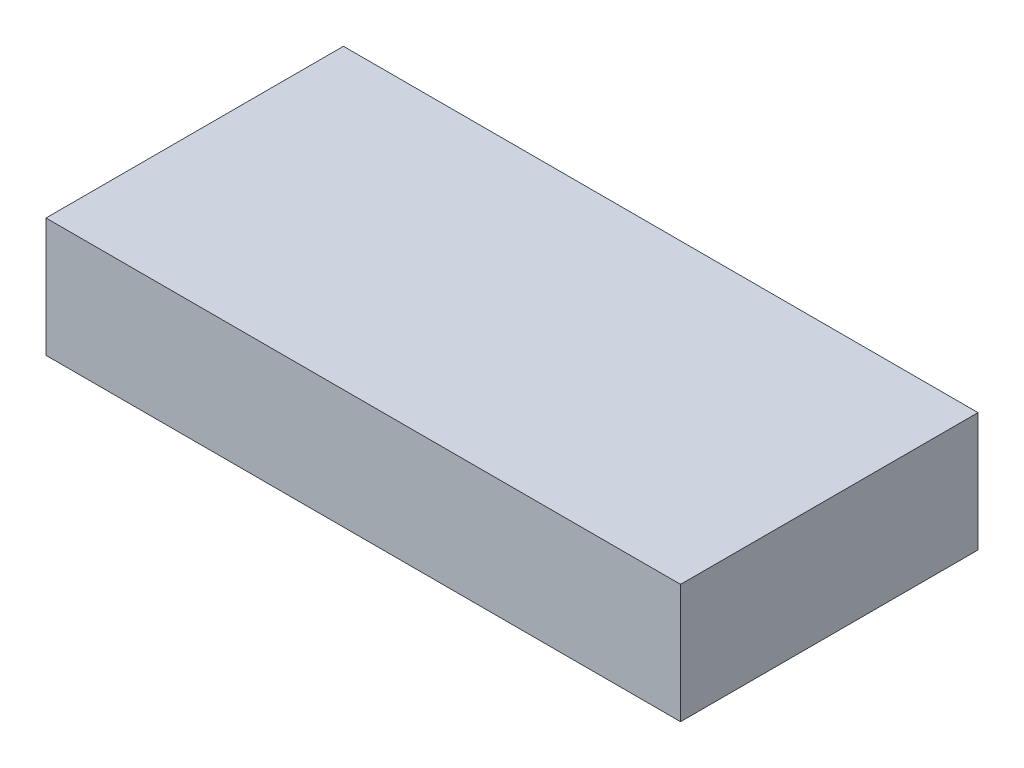
ISO-10303-21;
HEADER;
FILE_DESCRIPTION(('STEP AP214'),'2;1');
FILE_NAME('part.step','',(''),(''),'','','');
FILE_SCHEMA(('AUTOMOTIVE_DESIGN { 1 0 10303 214 1 1 1 1 }'));
ENDSEC;
DATA;
#1=APPLICATION_CONTEXT('core data for automotive mechanical design processes');
#2=APPLICATION_PROTOCOL_DEFINITION('international standard','automotive_design',2000,#1);
#3=PRODUCT_CONTEXT('',#1,'mechanical');
#4=PRODUCT('Part','Part','',(#3));
#5=PRODUCT_RELATED_PRODUCT_CATEGORY('part','',(#4));
#6=PRODUCT_DEFINITION_FORMATION('','',#4);
#7=PRODUCT_DEFINITION_CONTEXT('part definition',#1,'design');
#8=PRODUCT_DEFINITION('design','',#6,#7);
#9=PRODUCT_DEFINITION_SHAPE('','',#8);
#10=(LENGTH_UNIT() NAMED_UNIT(*) SI_UNIT(.MILLI.,.METRE.));
#11=(NAMED_UNIT(*) PLANE_ANGLE_UNIT() SI_UNIT($,.RADIAN.));
#12=(NAMED_UNIT(*) SI_UNIT($,.STERADIAN.) SOLID_ANGLE_UNIT());
#13=UNCERTAINTY_MEASURE_WITH_UNIT(LENGTH_MEASURE(1.E-05),#10,'distance_accuracy_value','');
#14=(GEOMETRIC_REPRESENTATION_CONTEXT(3) GLOBAL_UNCERTAINTY_ASSIGNED_CONTEXT((#13)) GLOBAL_UNIT_ASSIGNED_CONTEXT((#10,
#11,#12)) REPRESENTATION_CONTEXT('',''));
#15=CARTESIAN_POINT('',(0.,0.,0.));
#16=DIRECTION('',(0.,0.,1.));
#17=DIRECTION('',(1.,0.,0.));
#18=AXIS2_PLACEMENT_3D('',#15,#16,#17);
#19=CARTESIAN_POINT('',(50.8,-9.525,23.8125));
#20=DIRECTION('',(-1.,0.,0.));
#21=DIRECTION('',(0.,0.,1.));
#22=AXIS2_PLACEMENT_3D('',#19,#20,#21);
#23=PLANE('',#22);
#24=DIRECTION('',(0.,1.,0.));
#25=VECTOR('',#24,1.);
#26=CARTESIAN_POINT('',(50.8,-9.525,-23.8125));
#27=LINE('',#26,#25);
#28=CARTESIAN_POINT('',(50.8,-9.525,-23.8125));
#29=VERTEX_POINT('',#28);
#30=CARTESIAN_POINT('',(50.8,9.525,-23.8125));
#31=VERTEX_POINT('',#30);
#32=EDGE_CURVE('E96',#29,#31,#27,.T.);
#33=ORIENTED_EDGE('',*,*,#32,.T.);
#34=DIRECTION('',(0.,0.,-1.));
#35=VECTOR('',#34,1.);
#36=CARTESIAN_POINT('',(50.8,9.525,23.8125));
#37=LINE('',#36,#35);
#38=CARTESIAN_POINT('',(50.8,9.525,23.8125));
#39=VERTEX_POINT('',#38);
#40=EDGE_CURVE('E11',#39,#31,#37,.T.);
#41=ORIENTED_EDGE('',*,*,#40,.F.);
#42=DIRECTION('',(0.,1.,0.));
#43=VECTOR('',#42,1.);
#44=CARTESIAN_POINT('',(50.8,-9.525,23.8125));
#45=LINE('',#44,#43);
#46=CARTESIAN_POINT('',(50.8,-9.525,23.8125));
#47=VERTEX_POINT('',#46);
#48=EDGE_CURVE('E84',#47,#39,#45,.T.);
#49=ORIENTED_EDGE('',*,*,#48,.F.);
#50=DIRECTION('',(0.,0.,-1.));
#51=VECTOR('',#50,1.);
#52=CARTESIAN_POINT('',(50.8,-9.525,23.8125));
#53=LINE('',#52,#51);
#54=EDGE_CURVE('E92',#47,#29,#53,.T.);
#55=ORIENTED_EDGE('',*,*,#54,.T.);
#56=EDGE_LOOP('',(#33,#41,#49,#55));
#57=FACE_BOUND('',#56,.T.);
#58=ADVANCED_FACE('F33',(#57),#23,.F.);
#59=CARTESIAN_POINT('',(-50.8,9.525,23.8125));
#60=DIRECTION('',(0.,-1.,0.));
#61=DIRECTION('',(0.,0.,-1.));
#62=AXIS2_PLACEMENT_3D('',#59,#60,#61);
#63=PLANE('',#62);
#64=DIRECTION('',(-1.,0.,0.));
#65=VECTOR('',#64,1.);
#66=CARTESIAN_POINT('',(-50.8,9.525,-23.8125));
#67=LINE('',#66,#65);
#68=CARTESIAN_POINT('',(-50.8,9.525,-23.8125));
#69=VERTEX_POINT('',#68);
#70=EDGE_CURVE('E88',#31,#69,#67,.T.);
#71=ORIENTED_EDGE('',*,*,#70,.T.);
#72=DIRECTION('',(0.,0.,-1.));
#73=VECTOR('',#72,1.);
#74=CARTESIAN_POINT('',(-50.8,9.525,23.8125));
#75=LINE('',#74,#73);
#76=CARTESIAN_POINT('',(-50.8,9.525,23.8125));
#77=VERTEX_POINT('',#76);
#78=EDGE_CURVE('E41',#77,#69,#75,.T.);
#79=ORIENTED_EDGE('',*,*,#78,.F.);
#80=DIRECTION('',(-1.,0.,0.));
#81=VECTOR('',#80,1.);
#82=CARTESIAN_POINT('',(-50.8,9.525,23.8125));
#83=LINE('',#82,#81);
#84=EDGE_CURVE('E79',#39,#77,#83,.T.);
#85=ORIENTED_EDGE('',*,*,#84,.F.);
#86=ORIENTED_EDGE('',*,*,#40,.T.);
#87=EDGE_LOOP('',(#71,#79,#85,#86));
#88=FACE_BOUND('',#87,.T.);
#89=ADVANCED_FACE('F87',(#88),#63,.F.);
#90=CARTESIAN_POINT('',(-50.8,-9.525,23.8125));
#91=DIRECTION('',(1.,0.,0.));
#92=DIRECTION('',(0.,0.,-1.));
#93=AXIS2_PLACEMENT_3D('',#90,#91,#92);
#94=PLANE('',#93);
#95=DIRECTION('',(0.,-1.,0.));
#96=VECTOR('',#95,1.);
#97=CARTESIAN_POINT('',(-50.8,-9.525,-23.8125));
#98=LINE('',#97,#96);
#99=CARTESIAN_POINT('',(-50.8,-9.525,-23.8125));
#100=VERTEX_POINT('',#99);
#101=EDGE_CURVE('E66',#69,#100,#98,.T.);
#102=ORIENTED_EDGE('',*,*,#101,.T.);
#103=DIRECTION('',(0.,0.,-1.));
#104=VECTOR('',#103,1.);
#105=CARTESIAN_POINT('',(-50.8,-9.525,23.8125));
#106=LINE('',#105,#104);
#107=CARTESIAN_POINT('',(-50.8,-9.525,23.8125));
#108=VERTEX_POINT('',#107);
#109=EDGE_CURVE('E89',#108,#100,#106,.T.);
#110=ORIENTED_EDGE('',*,*,#109,.F.);
#111=DIRECTION('',(0.,-1.,0.));
#112=VECTOR('',#111,1.);
#113=CARTESIAN_POINT('',(-50.8,-9.525,23.8125));
#114=LINE('',#113,#112);
#115=EDGE_CURVE('E82',#77,#108,#114,.T.);
#116=ORIENTED_EDGE('',*,*,#115,.F.);
#117=ORIENTED_EDGE('',*,*,#78,.T.);
#118=EDGE_LOOP('',(#102,#110,#116,#117));
#119=FACE_BOUND('',#118,.T.);
#120=ADVANCED_FACE('F90',(#119),#94,.F.);
#121=CARTESIAN_POINT('',(-50.8,-9.525,23.8125));
#122=DIRECTION('',(0.,1.,0.));
#123=DIRECTION('',(0.,0.,1.));
#124=AXIS2_PLACEMENT_3D('',#121,#122,#123);
#125=PLANE('',#124);
#126=DIRECTION('',(1.,0.,0.));
#127=VECTOR('',#126,1.);
#128=CARTESIAN_POINT('',(-50.8,-9.525,-23.8125));
#129=LINE('',#128,#127);
#130=EDGE_CURVE('E72',#100,#29,#129,.T.);
#131=ORIENTED_EDGE('',*,*,#130,.T.);
#132=ORIENTED_EDGE('',*,*,#54,.F.);
#133=DIRECTION('',(1.,0.,0.));
#134=VECTOR('',#133,1.);
#135=CARTESIAN_POINT('',(-50.8,-9.525,23.8125));
#136=LINE('',#135,#134);
#137=EDGE_CURVE('E49',#108,#47,#136,.T.);
#138=ORIENTED_EDGE('',*,*,#137,.F.);
#139=ORIENTED_EDGE('',*,*,#109,.T.);
#140=EDGE_LOOP('',(#131,#132,#138,#139));
#141=FACE_BOUND('',#140,.T.);
#142=ADVANCED_FACE('F103',(#141),#125,.F.);
#143=CARTESIAN_POINT('',(0.,0.,23.8125));
#144=DIRECTION('',(0.,0.,-1.));
#145=DIRECTION('',(-1.,0.,0.));
#146=AXIS2_PLACEMENT_3D('',#143,#144,#145);
#147=PLANE('',#146);
#148=ORIENTED_EDGE('',*,*,#48,.T.);
#149=ORIENTED_EDGE('',*,*,#84,.T.);
#150=ORIENTED_EDGE('',*,*,#115,.T.);
#151=ORIENTED_EDGE('',*,*,#137,.T.);
#152=EDGE_LOOP('',(#148,#149,#150,#151));
#153=FACE_BOUND('',#152,.T.);
#154=ADVANCED_FACE('F80',(#153),#147,.F.);
#155=CARTESIAN_POINT('',(0.,0.,-23.8125));
#156=DIRECTION('',(0.,0.,-1.));
#157=DIRECTION('',(-1.,0.,0.));
#158=AXIS2_PLACEMENT_3D('',#155,#156,#157);
#159=PLANE('',#158);
#160=ORIENTED_EDGE('',*,*,#32,.F.);
#161=ORIENTED_EDGE('',*,*,#130,.F.);
#162=ORIENTED_EDGE('',*,*,#101,.F.);
#163=ORIENTED_EDGE('',*,*,#70,.F.);
#164=EDGE_LOOP('',(#160,#161,#162,#163));
#165=FACE_BOUND('',#164,.T.);
#166=ADVANCED_FACE('F106',(#165),#159,.T.);
#167=CLOSED_SHELL('',(#58,#89,#120,#142,#154,#166));
#168=MANIFOLD_SOLID_BREP('B2',#167);
#169=ADVANCED_BREP_SHAPE_REPRESENTATION('',(#18,#168),#14);
#170=SHAPE_DEFINITION_REPRESENTATION(#9,#169);
ENDSEC;
END-ISO-10303-21;
